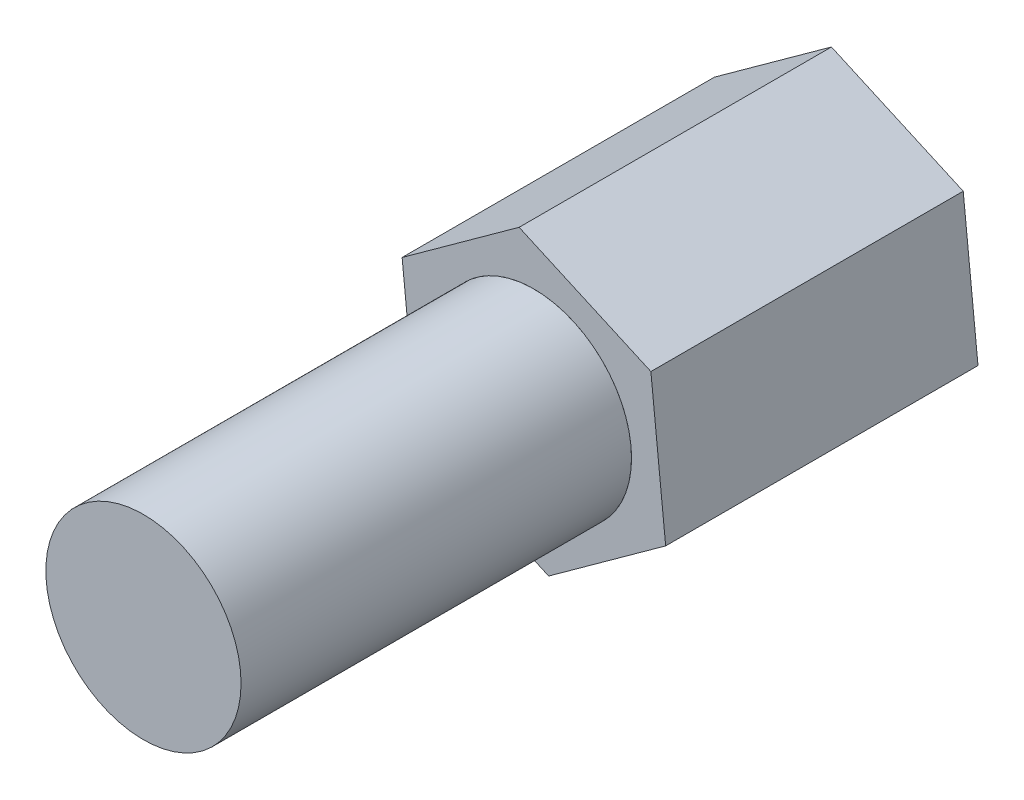
ISO-10303-21;
HEADER;
FILE_DESCRIPTION(('STEP AP214'),'2;1');
FILE_NAME('part.step','',(''),(''),'','','');
FILE_SCHEMA(('AUTOMOTIVE_DESIGN { 1 0 10303 214 1 1 1 1 }'));
ENDSEC;
DATA;
#1=APPLICATION_CONTEXT('core data for automotive mechanical design processes');
#2=APPLICATION_PROTOCOL_DEFINITION('international standard','automotive_design',2000,#1);
#3=PRODUCT_CONTEXT('',#1,'mechanical');
#4=PRODUCT('Part','Part','',(#3));
#5=PRODUCT_RELATED_PRODUCT_CATEGORY('part','',(#4));
#6=PRODUCT_DEFINITION_FORMATION('','',#4);
#7=PRODUCT_DEFINITION_CONTEXT('part definition',#1,'design');
#8=PRODUCT_DEFINITION('design','',#6,#7);
#9=PRODUCT_DEFINITION_SHAPE('','',#8);
#10=(LENGTH_UNIT() NAMED_UNIT(*) SI_UNIT(.MILLI.,.METRE.));
#11=(NAMED_UNIT(*) PLANE_ANGLE_UNIT() SI_UNIT($,.RADIAN.));
#12=(NAMED_UNIT(*) SI_UNIT($,.STERADIAN.) SOLID_ANGLE_UNIT());
#13=UNCERTAINTY_MEASURE_WITH_UNIT(LENGTH_MEASURE(1.E-05),#10,'distance_accuracy_value','');
#14=(GEOMETRIC_REPRESENTATION_CONTEXT(3) GLOBAL_UNCERTAINTY_ASSIGNED_CONTEXT((#13)) GLOBAL_UNIT_ASSIGNED_CONTEXT((#10,
#11,#12)) REPRESENTATION_CONTEXT('',''));
#15=CARTESIAN_POINT('',(0.,0.,0.));
#16=DIRECTION('',(0.,0.,1.));
#17=DIRECTION('',(1.,0.,0.));
#18=AXIS2_PLACEMENT_3D('',#15,#16,#17);
#19=CARTESIAN_POINT('',(22.5,21.,18.));
#20=DIRECTION('',(0.,0.,-1.));
#21=DIRECTION('',(-1.,0.,0.));
#22=AXIS2_PLACEMENT_3D('',#19,#20,#21);
#23=CYLINDRICAL_SURFACE('',#22,2.5);
#24=CARTESIAN_POINT('',(22.5,21.,18.));
#25=DIRECTION('',(0.,0.,1.));
#26=DIRECTION('',(1.,0.,0.));
#27=AXIS2_PLACEMENT_3D('',#24,#25,#26);
#28=CIRCLE('',#27,2.5);
#29=CARTESIAN_POINT('',(25.,21.,18.));
#30=VERTEX_POINT('',#29);
#31=EDGE_CURVE('E12',#30,#30,#28,.T.);
#32=ORIENTED_EDGE('',*,*,#31,.F.);
#33=EDGE_LOOP('',(#32));
#34=FACE_BOUND('',#33,.T.);
#35=CARTESIAN_POINT('',(22.5,21.,8.));
#36=DIRECTION('',(0.,0.,1.));
#37=DIRECTION('',(1.,0.,0.));
#38=AXIS2_PLACEMENT_3D('',#35,#36,#37);
#39=CIRCLE('',#38,2.5);
#40=CARTESIAN_POINT('',(25.,21.,8.));
#41=VERTEX_POINT('',#40);
#42=EDGE_CURVE('E55',#41,#41,#39,.T.);
#43=ORIENTED_EDGE('',*,*,#42,.T.);
#44=EDGE_LOOP('',(#43));
#45=FACE_BOUND('',#44,.T.);
#46=ADVANCED_FACE('F52',(#34,#45),#23,.T.);
#47=CARTESIAN_POINT('',(22.5,21.,18.));
#48=DIRECTION('',(0.,0.,1.));
#49=DIRECTION('',(1.,0.,0.));
#50=AXIS2_PLACEMENT_3D('',#47,#48,#49);
#51=PLANE('',#50);
#52=ORIENTED_EDGE('',*,*,#31,.T.);
#53=EDGE_LOOP('',(#52));
#54=FACE_BOUND('',#53,.T.);
#55=ADVANCED_FACE('F67',(#54),#51,.T.);
#56=CARTESIAN_POINT('',(22.5,21.,8.));
#57=DIRECTION('',(0.,0.,1.));
#58=DIRECTION('',(1.,0.,0.));
#59=AXIS2_PLACEMENT_3D('',#56,#57,#58);
#60=PLANE('',#59);
#61=ORIENTED_EDGE('',*,*,#42,.F.);
#62=EDGE_LOOP('',(#61));
#63=FACE_BOUND('',#62,.T.);
#64=ADVANCED_FACE('F65',(#63),#60,.F.);
#65=CLOSED_SHELL('',(#46,#55,#64));
#66=MANIFOLD_SOLID_BREP('B2',#65);
#67=CARTESIAN_POINT('',(25.4967105026686,23.1670371796883,17.9848350224043));
#68=DIRECTION('',(-0.408774184402462,-0.912635560432587,0.));
#69=DIRECTION('',(0.912635560432587,-0.408774184402462,0.));
#70=AXIS2_PLACEMENT_3D('',#67,#68,#69);
#71=PLANE('',#70);
#72=DIRECTION('',(-0.912635560432587,0.408774184402462,0.));
#73=VECTOR('',#72,1.);
#74=CARTESIAN_POINT('',(25.4967105026686,23.1670371796883,8.));
#75=LINE('',#74,#73);
#76=CARTESIAN_POINT('',(25.4967105026686,23.1670371796883,8.));
#77=VERTEX_POINT('',#76);
#78=CARTESIAN_POINT('',(22.1216460027789,24.6787460129428,8.));
#79=VERTEX_POINT('',#78);
#80=EDGE_CURVE('E175',#77,#79,#75,.T.);
#81=ORIENTED_EDGE('',*,*,#80,.F.);
#82=DIRECTION('',(0.,0.,-1.));
#83=VECTOR('',#82,1.);
#84=CARTESIAN_POINT('',(25.4967105026686,23.1670371796883,17.9848350224043));
#85=LINE('',#84,#83);
#86=CARTESIAN_POINT('',(25.4967105026686,23.1670371796883,0.));
#87=VERTEX_POINT('',#86);
#88=EDGE_CURVE('E98',#77,#87,#85,.T.);
#89=ORIENTED_EDGE('',*,*,#88,.T.);
#90=DIRECTION('',(-0.912635560432587,0.408774184402462,0.));
#91=VECTOR('',#90,1.);
#92=CARTESIAN_POINT('',(25.4967105026686,23.1670371796883,0.));
#93=LINE('',#92,#91);
#94=CARTESIAN_POINT('',(22.1216460027789,24.6787460129428,0.));
#95=VERTEX_POINT('',#94);
#96=EDGE_CURVE('E183',#87,#95,#93,.T.);
#97=ORIENTED_EDGE('',*,*,#96,.T.);
#98=DIRECTION('',(0.,0.,-1.));
#99=VECTOR('',#98,1.);
#100=CARTESIAN_POINT('',(22.1216460027789,24.6787460129428,17.9848350224043));
#101=LINE('',#100,#99);
#102=EDGE_CURVE('E141',#79,#95,#101,.T.);
#103=ORIENTED_EDGE('',*,*,#102,.F.);
#104=EDGE_LOOP('',(#81,#89,#97,#103));
#105=FACE_BOUND('',#104,.T.);
#106=ADVANCED_FACE('F94',(#105),#71,.F.);
#107=CARTESIAN_POINT('',(22.1216460027789,24.6787460129428,17.9848350224043));
#108=DIRECTION('',(0.585978487530437,-0.810326608320091,0.));
#109=DIRECTION('',(0.810326608320091,0.585978487530437,0.));
#110=AXIS2_PLACEMENT_3D('',#107,#108,#109);
#111=PLANE('',#110);
#112=DIRECTION('',(-0.810326608320091,-0.585978487530437,0.));
#113=VECTOR('',#112,1.);
#114=CARTESIAN_POINT('',(22.1216460027789,24.6787460129428,8.));
#115=LINE('',#114,#113);
#116=CARTESIAN_POINT('',(19.1249355001103,22.5117088332545,8.));
#117=VERTEX_POINT('',#116);
#118=EDGE_CURVE('E148',#79,#117,#115,.T.);
#119=ORIENTED_EDGE('',*,*,#118,.F.);
#120=ORIENTED_EDGE('',*,*,#102,.T.);
#121=DIRECTION('',(-0.810326608320091,-0.585978487530437,0.));
#122=VECTOR('',#121,1.);
#123=CARTESIAN_POINT('',(22.1216460027789,24.6787460129428,0.));
#124=LINE('',#123,#122);
#125=CARTESIAN_POINT('',(19.1249355001103,22.5117088332545,0.));
#126=VERTEX_POINT('',#125);
#127=EDGE_CURVE('E182',#95,#126,#124,.T.);
#128=ORIENTED_EDGE('',*,*,#127,.T.);
#129=DIRECTION('',(0.,0.,-1.));
#130=VECTOR('',#129,1.);
#131=CARTESIAN_POINT('',(19.1249355001103,22.5117088332545,17.9848350224043));
#132=LINE('',#131,#130);
#133=EDGE_CURVE('E184',#117,#126,#132,.T.);
#134=ORIENTED_EDGE('',*,*,#133,.F.);
#135=EDGE_LOOP('',(#119,#120,#128,#134));
#136=FACE_BOUND('',#135,.T.);
#137=ADVANCED_FACE('F216',(#136),#111,.F.);
#138=CARTESIAN_POINT('',(19.1249355001103,22.5117088332545,17.9848350224043));
#139=DIRECTION('',(0.9947526719329,0.102308952112496,0.));
#140=DIRECTION('',(-0.102308952112496,0.9947526719329,0.));
#141=AXIS2_PLACEMENT_3D('',#138,#139,#140);
#142=PLANE('',#141);
#143=DIRECTION('',(0.102308952112496,-0.9947526719329,0.));
#144=VECTOR('',#143,1.);
#145=CARTESIAN_POINT('',(19.1249355001103,22.5117088332545,8.));
#146=LINE('',#145,#144);
#147=CARTESIAN_POINT('',(19.5032894973314,18.8329628203118,8.));
#148=VERTEX_POINT('',#147);
#149=EDGE_CURVE('E169',#117,#148,#146,.T.);
#150=ORIENTED_EDGE('',*,*,#149,.F.);
#151=ORIENTED_EDGE('',*,*,#133,.T.);
#152=DIRECTION('',(0.102308952112496,-0.9947526719329,0.));
#153=VECTOR('',#152,1.);
#154=CARTESIAN_POINT('',(19.1249355001103,22.5117088332545,0.));
#155=LINE('',#154,#153);
#156=CARTESIAN_POINT('',(19.5032894973314,18.8329628203118,0.));
#157=VERTEX_POINT('',#156);
#158=EDGE_CURVE('E186',#126,#157,#155,.T.);
#159=ORIENTED_EDGE('',*,*,#158,.T.);
#160=DIRECTION('',(0.,0.,-1.));
#161=VECTOR('',#160,1.);
#162=CARTESIAN_POINT('',(19.5032894973314,18.8329628203118,17.9848350224043));
#163=LINE('',#162,#161);
#164=EDGE_CURVE('E187',#148,#157,#163,.T.);
#165=ORIENTED_EDGE('',*,*,#164,.F.);
#166=EDGE_LOOP('',(#150,#151,#159,#165));
#167=FACE_BOUND('',#166,.T.);
#168=ADVANCED_FACE('F222',(#167),#142,.F.);
#169=CARTESIAN_POINT('',(19.5032894973314,18.8329628203118,17.9848350224043));
#170=DIRECTION('',(0.408774184402461,0.912635560432587,0.));
#171=DIRECTION('',(-0.912635560432587,0.408774184402461,0.));
#172=AXIS2_PLACEMENT_3D('',#169,#170,#171);
#173=PLANE('',#172);
#174=DIRECTION('',(0.912635560432587,-0.408774184402461,0.));
#175=VECTOR('',#174,1.);
#176=CARTESIAN_POINT('',(19.5032894973314,18.8329628203118,8.));
#177=LINE('',#176,#175);
#178=CARTESIAN_POINT('',(22.8783539972211,17.3212539870573,8.));
#179=VERTEX_POINT('',#178);
#180=EDGE_CURVE('E103',#148,#179,#177,.T.);
#181=ORIENTED_EDGE('',*,*,#180,.F.);
#182=ORIENTED_EDGE('',*,*,#164,.T.);
#183=DIRECTION('',(0.912635560432587,-0.408774184402461,0.));
#184=VECTOR('',#183,1.);
#185=CARTESIAN_POINT('',(19.5032894973314,18.8329628203118,0.));
#186=LINE('',#185,#184);
#187=CARTESIAN_POINT('',(22.8783539972211,17.3212539870573,0.));
#188=VERTEX_POINT('',#187);
#189=EDGE_CURVE('E164',#157,#188,#186,.T.);
#190=ORIENTED_EDGE('',*,*,#189,.T.);
#191=DIRECTION('',(0.,0.,-1.));
#192=VECTOR('',#191,1.);
#193=CARTESIAN_POINT('',(22.8783539972211,17.3212539870573,17.9848350224043));
#194=LINE('',#193,#192);
#195=EDGE_CURVE('E155',#179,#188,#194,.T.);
#196=ORIENTED_EDGE('',*,*,#195,.F.);
#197=EDGE_LOOP('',(#181,#182,#190,#196));
#198=FACE_BOUND('',#197,.T.);
#199=ADVANCED_FACE('F161',(#198),#173,.F.);
#200=CARTESIAN_POINT('',(22.8783539972211,17.3212539870573,17.9848350224043));
#201=DIRECTION('',(-0.585978487530437,0.81032660832009,0.));
#202=DIRECTION('',(-0.81032660832009,-0.585978487530437,0.));
#203=AXIS2_PLACEMENT_3D('',#200,#201,#202);
#204=PLANE('',#203);
#205=DIRECTION('',(0.81032660832009,0.585978487530437,0.));
#206=VECTOR('',#205,1.);
#207=CARTESIAN_POINT('',(22.8783539972211,17.3212539870573,8.));
#208=LINE('',#207,#206);
#209=CARTESIAN_POINT('',(25.8750644998897,19.4882911667455,8.));
#210=VERTEX_POINT('',#209);
#211=EDGE_CURVE('E50',#179,#210,#208,.T.);
#212=ORIENTED_EDGE('',*,*,#211,.F.);
#213=ORIENTED_EDGE('',*,*,#195,.T.);
#214=DIRECTION('',(0.81032660832009,0.585978487530437,0.));
#215=VECTOR('',#214,1.);
#216=CARTESIAN_POINT('',(22.8783539972211,17.3212539870573,0.));
#217=LINE('',#216,#215);
#218=CARTESIAN_POINT('',(25.8750644998897,19.4882911667455,0.));
#219=VERTEX_POINT('',#218);
#220=EDGE_CURVE('E166',#188,#219,#217,.T.);
#221=ORIENTED_EDGE('',*,*,#220,.T.);
#222=DIRECTION('',(0.,0.,-1.));
#223=VECTOR('',#222,1.);
#224=CARTESIAN_POINT('',(25.8750644998897,19.4882911667455,17.9848350224043));
#225=LINE('',#224,#223);
#226=EDGE_CURVE('E116',#210,#219,#225,.T.);
#227=ORIENTED_EDGE('',*,*,#226,.F.);
#228=EDGE_LOOP('',(#212,#213,#221,#227));
#229=FACE_BOUND('',#228,.T.);
#230=ADVANCED_FACE('F154',(#229),#204,.F.);
#231=CARTESIAN_POINT('',(25.8750644998897,19.4882911667455,17.9848350224043));
#232=DIRECTION('',(-0.9947526719329,-0.102308952112497,0.));
#233=DIRECTION('',(0.102308952112497,-0.9947526719329,0.));
#234=AXIS2_PLACEMENT_3D('',#231,#232,#233);
#235=PLANE('',#234);
#236=DIRECTION('',(-0.102308952112497,0.9947526719329,0.));
#237=VECTOR('',#236,1.);
#238=CARTESIAN_POINT('',(25.8750644998897,19.4882911667455,8.));
#239=LINE('',#238,#237);
#240=EDGE_CURVE('E178',#210,#77,#239,.T.);
#241=ORIENTED_EDGE('',*,*,#240,.F.);
#242=ORIENTED_EDGE('',*,*,#226,.T.);
#243=DIRECTION('',(-0.102308952112497,0.9947526719329,0.));
#244=VECTOR('',#243,1.);
#245=CARTESIAN_POINT('',(25.8750644998897,19.4882911667455,0.));
#246=LINE('',#245,#244);
#247=EDGE_CURVE('E180',#219,#87,#246,.T.);
#248=ORIENTED_EDGE('',*,*,#247,.T.);
#249=ORIENTED_EDGE('',*,*,#88,.F.);
#250=EDGE_LOOP('',(#241,#242,#248,#249));
#251=FACE_BOUND('',#250,.T.);
#252=ADVANCED_FACE('F213',(#251),#235,.F.);
#253=CARTESIAN_POINT('',(0.,0.,0.));
#254=DIRECTION('',(0.,0.,1.));
#255=DIRECTION('',(1.,0.,0.));
#256=AXIS2_PLACEMENT_3D('',#253,#254,#255);
#257=PLANE('',#256);
#258=CARTESIAN_POINT('',(22.5,21.,0.));
#259=DIRECTION('',(0.,0.,-1.));
#260=DIRECTION('',(-1.,0.,0.));
#261=AXIS2_PLACEMENT_3D('',#258,#259,#260);
#262=CIRCLE('',#261,2.5);
#263=CARTESIAN_POINT('',(20.,21.,0.));
#264=VERTEX_POINT('',#263);
#265=EDGE_CURVE('E201',#264,#264,#262,.T.);
#266=ORIENTED_EDGE('',*,*,#265,.F.);
#267=EDGE_LOOP('',(#266));
#268=FACE_BOUND('',#267,.T.);
#269=ORIENTED_EDGE('',*,*,#96,.F.);
#270=ORIENTED_EDGE('',*,*,#247,.F.);
#271=ORIENTED_EDGE('',*,*,#220,.F.);
#272=ORIENTED_EDGE('',*,*,#189,.F.);
#273=ORIENTED_EDGE('',*,*,#158,.F.);
#274=ORIENTED_EDGE('',*,*,#127,.F.);
#275=EDGE_LOOP('',(#269,#270,#271,#272,#273,#274));
#276=FACE_BOUND('',#275,.T.);
#277=ADVANCED_FACE('F210',(#268,#276),#257,.F.);
#278=CARTESIAN_POINT('',(30.,-27.5,8.));
#279=DIRECTION('',(0.,0.,1.));
#280=DIRECTION('',(1.,0.,0.));
#281=AXIS2_PLACEMENT_3D('',#278,#279,#280);
#282=PLANE('',#281);
#283=CARTESIAN_POINT('',(22.5,21.,8.));
#284=DIRECTION('',(0.,0.,-1.));
#285=DIRECTION('',(-1.,0.,0.));
#286=AXIS2_PLACEMENT_3D('',#283,#284,#285);
#287=CIRCLE('',#286,2.5);
#288=CARTESIAN_POINT('',(20.,21.,8.));
#289=VERTEX_POINT('',#288);
#290=EDGE_CURVE('E199',#289,#289,#287,.T.);
#291=ORIENTED_EDGE('',*,*,#290,.T.);
#292=EDGE_LOOP('',(#291));
#293=FACE_BOUND('',#292,.T.);
#294=ORIENTED_EDGE('',*,*,#240,.T.);
#295=ORIENTED_EDGE('',*,*,#80,.T.);
#296=ORIENTED_EDGE('',*,*,#118,.T.);
#297=ORIENTED_EDGE('',*,*,#149,.T.);
#298=ORIENTED_EDGE('',*,*,#180,.T.);
#299=ORIENTED_EDGE('',*,*,#211,.T.);
#300=EDGE_LOOP('',(#294,#295,#296,#297,#298,#299));
#301=FACE_BOUND('',#300,.T.);
#302=ADVANCED_FACE('F96',(#293,#301),#282,.T.);
#303=CARTESIAN_POINT('',(22.5,21.,8.));
#304=DIRECTION('',(0.,0.,-1.));
#305=DIRECTION('',(-1.,0.,0.));
#306=AXIS2_PLACEMENT_3D('',#303,#304,#305);
#307=CYLINDRICAL_SURFACE('',#306,2.5);
#308=ORIENTED_EDGE('',*,*,#290,.F.);
#309=EDGE_LOOP('',(#308));
#310=FACE_BOUND('',#309,.T.);
#311=ORIENTED_EDGE('',*,*,#265,.T.);
#312=EDGE_LOOP('',(#311));
#313=FACE_BOUND('',#312,.T.);
#314=ADVANCED_FACE('F208',(#310,#313),#307,.F.);
#315=CLOSED_SHELL('',(#106,#137,#168,#199,#230,#252,#277,#302,#314));
#316=MANIFOLD_SOLID_BREP('B7',#315);
#317=ADVANCED_BREP_SHAPE_REPRESENTATION('',(#18,#66,#316),#14);
#318=SHAPE_DEFINITION_REPRESENTATION(#9,#317);
ENDSEC;
END-ISO-10303-21;
